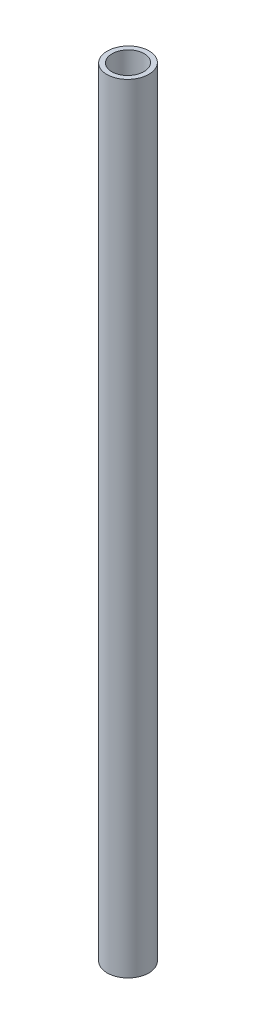
ISO-10303-21;
HEADER;
FILE_DESCRIPTION(('STEP AP214'),'2;1');
FILE_NAME('part.step','',(''),(''),'','','');
FILE_SCHEMA(('AUTOMOTIVE_DESIGN { 1 0 10303 214 1 1 1 1 }'));
ENDSEC;
DATA;
#1=APPLICATION_CONTEXT('core data for automotive mechanical design processes');
#2=APPLICATION_PROTOCOL_DEFINITION('international standard','automotive_design',2000,#1);
#3=PRODUCT_CONTEXT('',#1,'mechanical');
#4=PRODUCT('Part','Part','',(#3));
#5=PRODUCT_RELATED_PRODUCT_CATEGORY('part','',(#4));
#6=PRODUCT_DEFINITION_FORMATION('','',#4);
#7=PRODUCT_DEFINITION_CONTEXT('part definition',#1,'design');
#8=PRODUCT_DEFINITION('design','',#6,#7);
#9=PRODUCT_DEFINITION_SHAPE('','',#8);
#10=(LENGTH_UNIT() NAMED_UNIT(*) SI_UNIT(.MILLI.,.METRE.));
#11=(NAMED_UNIT(*) PLANE_ANGLE_UNIT() SI_UNIT($,.RADIAN.));
#12=(NAMED_UNIT(*) SI_UNIT($,.STERADIAN.) SOLID_ANGLE_UNIT());
#13=UNCERTAINTY_MEASURE_WITH_UNIT(LENGTH_MEASURE(1.E-05),#10,'distance_accuracy_value','');
#14=(GEOMETRIC_REPRESENTATION_CONTEXT(3) GLOBAL_UNCERTAINTY_ASSIGNED_CONTEXT((#13)) GLOBAL_UNIT_ASSIGNED_CONTEXT((#10,
#11,#12)) REPRESENTATION_CONTEXT('',''));
#15=CARTESIAN_POINT('',(0.,0.,0.));
#16=DIRECTION('',(0.,0.,1.));
#17=DIRECTION('',(1.,0.,0.));
#18=AXIS2_PLACEMENT_3D('',#15,#16,#17);
#19=CARTESIAN_POINT('',(0.,136.751216141925,0.));
#20=DIRECTION('',(0.,-1.,0.));
#21=DIRECTION('',(0.,0.,-1.));
#22=AXIS2_PLACEMENT_3D('',#19,#20,#21);
#23=CYLINDRICAL_SURFACE('',#22,4.8768);
#24=CARTESIAN_POINT('',(0.,118.789607446869,0.));
#25=DIRECTION('',(0.0156252100320456,-0.999877918953836,0.));
#26=DIRECTION('',(-0.999877918953836,-0.0156252100320456,0.));
#27=AXIS2_PLACEMENT_3D('',#24,#25,#26);
#28=ELLIPSE('',#27,4.87739543753757,4.8768);
#29=CARTESIAN_POINT('',(-4.8768,118.713397118748,2.32548444289317E-13));
#30=VERTEX_POINT('',#29);
#31=EDGE_CURVE('E10',#30,#30,#28,.T.);
#32=ORIENTED_EDGE('',*,*,#31,.F.);
#33=EDGE_LOOP('',(#32));
#34=FACE_BOUND('',#33,.T.);
#35=CARTESIAN_POINT('',(1.8979123828089E-13,-118.79038275616,-2.84032866670891E-13));
#36=DIRECTION('',(0.,1.,0.));
#37=DIRECTION('',(1.,0.,0.));
#38=AXIS2_PLACEMENT_3D('',#35,#36,#37);
#39=CIRCLE('',#38,4.8768);
#40=CARTESIAN_POINT('',(4.87680000000019,-118.79038275616,-2.8338991431287E-13));
#41=VERTEX_POINT('',#40);
#42=EDGE_CURVE('E47',#41,#41,#39,.T.);
#43=ORIENTED_EDGE('',*,*,#42,.F.);
#44=EDGE_LOOP('',(#43));
#45=FACE_BOUND('',#44,.T.);
#46=ADVANCED_FACE('F33',(#34,#45),#23,.F.);
#47=CARTESIAN_POINT('',(0.,136.751216141925,0.));
#48=DIRECTION('',(0.,-1.,0.));
#49=DIRECTION('',(0.,0.,-1.));
#50=AXIS2_PLACEMENT_3D('',#47,#48,#49);
#51=CYLINDRICAL_SURFACE('',#50,6.35);
#52=CARTESIAN_POINT('',(0.,118.789607446869,0.));
#53=DIRECTION('',(0.0156252100320456,-0.999877918953836,0.));
#54=DIRECTION('',(-0.999877918953836,-0.0156252100320456,0.));
#55=AXIS2_PLACEMENT_3D('',#52,#53,#54);
#56=ELLIPSE('',#55,6.35077530929371,6.35);
#57=CARTESIAN_POINT('',(-6.35,118.690375248795,3.02797453501715E-13));
#58=VERTEX_POINT('',#57);
#59=EDGE_CURVE('E36',#58,#58,#56,.T.);
#60=ORIENTED_EDGE('',*,*,#59,.T.);
#61=EDGE_LOOP('',(#60));
#62=FACE_BOUND('',#61,.T.);
#63=CARTESIAN_POINT('',(1.8979123828089E-13,-118.79038275616,-2.84032866670891E-13));
#64=DIRECTION('',(0.,1.,0.));
#65=DIRECTION('',(1.,0.,0.));
#66=AXIS2_PLACEMENT_3D('',#63,#64,#65);
#67=CIRCLE('',#66,6.35);
#68=CARTESIAN_POINT('',(6.35000000000019,-118.79038275616,-2.83195689121385E-13));
#69=VERTEX_POINT('',#68);
#70=EDGE_CURVE('E43',#69,#69,#67,.T.);
#71=ORIENTED_EDGE('',*,*,#70,.T.);
#72=EDGE_LOOP('',(#71));
#73=FACE_BOUND('',#72,.T.);
#74=ADVANCED_FACE('F55',(#62,#73),#51,.T.);
#75=CARTESIAN_POINT('',(0.396843996146577,118.795808974748,-2.14947694212832E-13));
#76=DIRECTION('',(0.0156252100320456,-0.999877918953836,0.));
#77=DIRECTION('',(-0.999877918953836,-0.0156252100320456,0.));
#78=AXIS2_PLACEMENT_3D('',#75,#76,#77);
#79=PLANE('',#78);
#80=ORIENTED_EDGE('',*,*,#31,.T.);
#81=EDGE_LOOP('',(#80));
#82=FACE_BOUND('',#81,.T.);
#83=ORIENTED_EDGE('',*,*,#59,.F.);
#84=EDGE_LOOP('',(#83));
#85=FACE_BOUND('',#84,.T.);
#86=ADVANCED_FACE('F60',(#82,#85),#79,.F.);
#87=CARTESIAN_POINT('',(1.8979123828089E-13,-118.79038275616,-2.84032866670891E-13));
#88=DIRECTION('',(0.,1.,0.));
#89=DIRECTION('',(1.,0.,0.));
#90=AXIS2_PLACEMENT_3D('',#87,#88,#89);
#91=PLANE('',#90);
#92=ORIENTED_EDGE('',*,*,#42,.T.);
#93=EDGE_LOOP('',(#92));
#94=FACE_BOUND('',#93,.T.);
#95=ORIENTED_EDGE('',*,*,#70,.F.);
#96=EDGE_LOOP('',(#95));
#97=FACE_BOUND('',#96,.T.);
#98=ADVANCED_FACE('F51',(#94,#97),#91,.F.);
#99=CLOSED_SHELL('',(#46,#74,#86,#98));
#100=MANIFOLD_SOLID_BREP('B2',#99);
#101=ADVANCED_BREP_SHAPE_REPRESENTATION('',(#18,#100),#14);
#102=SHAPE_DEFINITION_REPRESENTATION(#9,#101);
ENDSEC;
END-ISO-10303-21;
